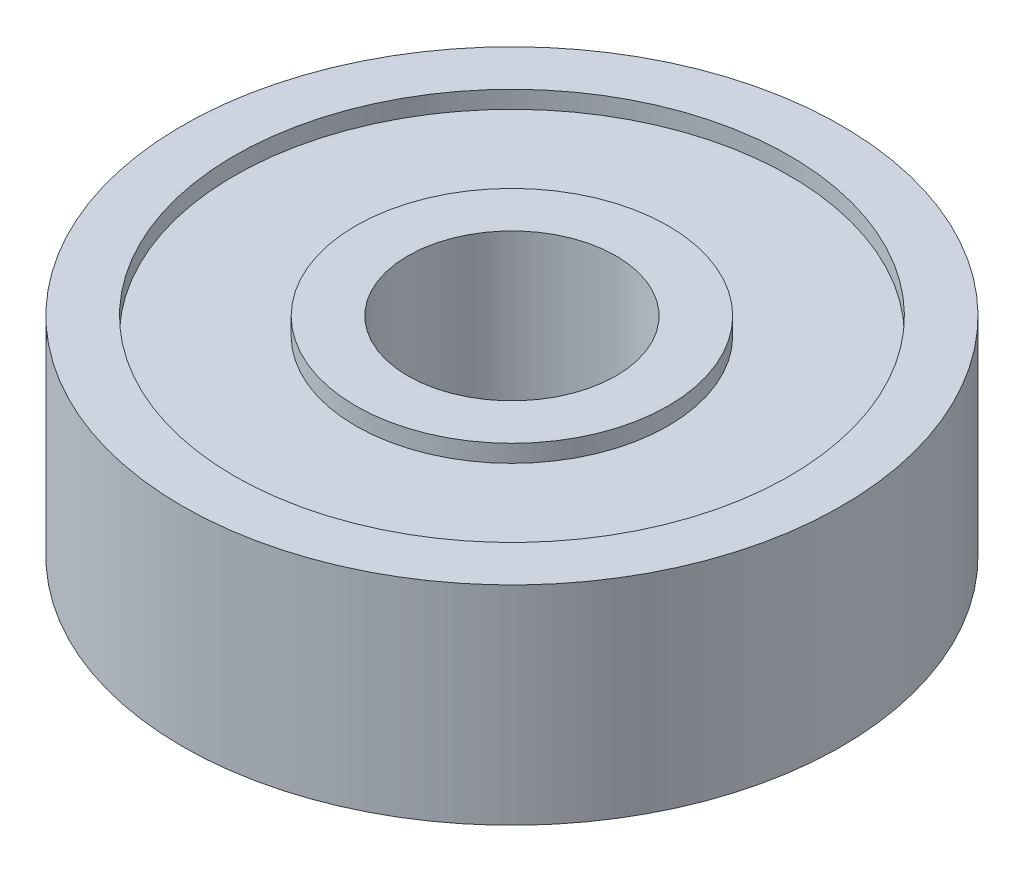
ISO-10303-21;
HEADER;
FILE_DESCRIPTION(('STEP AP214'),'2;1');
FILE_NAME('part.step','',(''),(''),'','','');
FILE_SCHEMA(('AUTOMOTIVE_DESIGN { 1 0 10303 214 1 1 1 1 }'));
ENDSEC;
DATA;
#1=APPLICATION_CONTEXT('core data for automotive mechanical design processes');
#2=APPLICATION_PROTOCOL_DEFINITION('international standard','automotive_design',2000,#1);
#3=PRODUCT_CONTEXT('',#1,'mechanical');
#4=PRODUCT('Part','Part','',(#3));
#5=PRODUCT_RELATED_PRODUCT_CATEGORY('part','',(#4));
#6=PRODUCT_DEFINITION_FORMATION('','',#4);
#7=PRODUCT_DEFINITION_CONTEXT('part definition',#1,'design');
#8=PRODUCT_DEFINITION('design','',#6,#7);
#9=PRODUCT_DEFINITION_SHAPE('','',#8);
#10=(LENGTH_UNIT() NAMED_UNIT(*) SI_UNIT(.MILLI.,.METRE.));
#11=(NAMED_UNIT(*) PLANE_ANGLE_UNIT() SI_UNIT($,.RADIAN.));
#12=(NAMED_UNIT(*) SI_UNIT($,.STERADIAN.) SOLID_ANGLE_UNIT());
#13=UNCERTAINTY_MEASURE_WITH_UNIT(LENGTH_MEASURE(1.E-05),#10,'distance_accuracy_value','');
#14=(GEOMETRIC_REPRESENTATION_CONTEXT(3) GLOBAL_UNCERTAINTY_ASSIGNED_CONTEXT((#13)) GLOBAL_UNIT_ASSIGNED_CONTEXT((#10,
#11,#12)) REPRESENTATION_CONTEXT('',''));
#15=CARTESIAN_POINT('',(0.,0.,0.));
#16=DIRECTION('',(0.,0.,1.));
#17=DIRECTION('',(1.,0.,0.));
#18=AXIS2_PLACEMENT_3D('',#15,#16,#17);
#19=CARTESIAN_POINT('',(0.,13.877117287543,0.));
#20=DIRECTION('',(0.,1.,0.));
#21=DIRECTION('',(0.,0.,1.));
#22=AXIS2_PLACEMENT_3D('',#19,#20,#21);
#23=CYLINDRICAL_SURFACE('',#22,4.5);
#24=CARTESIAN_POINT('',(0.,-2.5,0.));
#25=DIRECTION('',(0.,1.,0.));
#26=DIRECTION('',(0.,0.,1.));
#27=AXIS2_PLACEMENT_3D('',#24,#25,#26);
#28=CIRCLE('',#27,4.5);
#29=CARTESIAN_POINT('',(0.,-2.5,4.5));
#30=VERTEX_POINT('',#29);
#31=EDGE_CURVE('E55',#30,#30,#28,.T.);
#32=ORIENTED_EDGE('',*,*,#31,.F.);
#33=EDGE_LOOP('',(#32));
#34=FACE_BOUND('',#33,.T.);
#35=CARTESIAN_POINT('',(0.,-3.,0.));
#36=DIRECTION('',(0.,1.,0.));
#37=DIRECTION('',(0.,0.,1.));
#38=AXIS2_PLACEMENT_3D('',#35,#36,#37);
#39=CIRCLE('',#38,4.5);
#40=CARTESIAN_POINT('',(0.,-3.,4.5));
#41=VERTEX_POINT('',#40);
#42=EDGE_CURVE('E39',#41,#41,#39,.T.);
#43=ORIENTED_EDGE('',*,*,#42,.T.);
#44=EDGE_LOOP('',(#43));
#45=FACE_BOUND('',#44,.T.);
#46=ADVANCED_FACE('F32',(#34,#45),#23,.T.);
#47=CARTESIAN_POINT('',(0.,13.877117287543,0.));
#48=DIRECTION('',(0.,1.,0.));
#49=DIRECTION('',(0.,0.,1.));
#50=AXIS2_PLACEMENT_3D('',#47,#48,#49);
#51=CYLINDRICAL_SURFACE('',#50,3.);
#52=CARTESIAN_POINT('',(0.,-3.,0.));
#53=DIRECTION('',(0.,1.,0.));
#54=DIRECTION('',(0.,0.,1.));
#55=AXIS2_PLACEMENT_3D('',#52,#53,#54);
#56=CIRCLE('',#55,3.);
#57=CARTESIAN_POINT('',(0.,-3.,3.));
#58=VERTEX_POINT('',#57);
#59=EDGE_CURVE('E10',#58,#58,#56,.T.);
#60=ORIENTED_EDGE('',*,*,#59,.F.);
#61=EDGE_LOOP('',(#60));
#62=FACE_BOUND('',#61,.T.);
#63=CARTESIAN_POINT('',(0.,3.,0.));
#64=DIRECTION('',(0.,1.,0.));
#65=DIRECTION('',(0.,0.,1.));
#66=AXIS2_PLACEMENT_3D('',#63,#64,#65);
#67=CIRCLE('',#66,3.);
#68=CARTESIAN_POINT('',(0.,3.,3.));
#69=VERTEX_POINT('',#68);
#70=EDGE_CURVE('E47',#69,#69,#67,.T.);
#71=ORIENTED_EDGE('',*,*,#70,.T.);
#72=EDGE_LOOP('',(#71));
#73=FACE_BOUND('',#72,.T.);
#74=ADVANCED_FACE('F34',(#62,#73),#51,.F.);
#75=CARTESIAN_POINT('',(3.,-3.,0.));
#76=DIRECTION('',(0.,1.,0.));
#77=DIRECTION('',(0.,0.,1.));
#78=AXIS2_PLACEMENT_3D('',#75,#76,#77);
#79=PLANE('',#78);
#80=ORIENTED_EDGE('',*,*,#42,.F.);
#81=EDGE_LOOP('',(#80));
#82=FACE_BOUND('',#81,.T.);
#83=ORIENTED_EDGE('',*,*,#59,.T.);
#84=EDGE_LOOP('',(#83));
#85=FACE_BOUND('',#84,.T.);
#86=ADVANCED_FACE('F117',(#82,#85),#79,.F.);
#87=CARTESIAN_POINT('',(0.,2.5,0.));
#88=DIRECTION('',(0.,1.,0.));
#89=DIRECTION('',(0.,0.,1.));
#90=AXIS2_PLACEMENT_3D('',#87,#88,#89);
#91=CIRCLE('',#90,4.5);
#92=CARTESIAN_POINT('',(0.,2.5,4.5));
#93=VERTEX_POINT('',#92);
#94=EDGE_CURVE('E58',#93,#93,#91,.T.);
#95=ORIENTED_EDGE('',*,*,#94,.T.);
#96=EDGE_LOOP('',(#95));
#97=FACE_BOUND('',#96,.T.);
#98=CARTESIAN_POINT('',(0.,3.,0.));
#99=DIRECTION('',(0.,1.,0.));
#100=DIRECTION('',(0.,0.,1.));
#101=AXIS2_PLACEMENT_3D('',#98,#99,#100);
#102=CIRCLE('',#101,4.5);
#103=CARTESIAN_POINT('',(0.,3.,4.5));
#104=VERTEX_POINT('',#103);
#105=EDGE_CURVE('E43',#104,#104,#102,.T.);
#106=ORIENTED_EDGE('',*,*,#105,.F.);
#107=EDGE_LOOP('',(#106));
#108=FACE_BOUND('',#107,.T.);
#109=ADVANCED_FACE('F113',(#97,#108),#23,.T.);
#110=CARTESIAN_POINT('',(3.,3.,0.));
#111=DIRECTION('',(0.,-1.,0.));
#112=DIRECTION('',(0.,0.,-1.));
#113=AXIS2_PLACEMENT_3D('',#110,#111,#112);
#114=PLANE('',#113);
#115=ORIENTED_EDGE('',*,*,#70,.F.);
#116=EDGE_LOOP('',(#115));
#117=FACE_BOUND('',#116,.T.);
#118=ORIENTED_EDGE('',*,*,#105,.T.);
#119=EDGE_LOOP('',(#118));
#120=FACE_BOUND('',#119,.T.);
#121=ADVANCED_FACE('F122',(#117,#120),#114,.F.);
#122=CARTESIAN_POINT('',(-8.,-2.5,0.));
#123=DIRECTION('',(0.,-1.,0.));
#124=DIRECTION('',(0.,0.,-1.));
#125=AXIS2_PLACEMENT_3D('',#122,#123,#124);
#126=PLANE('',#125);
#127=ORIENTED_EDGE('',*,*,#31,.T.);
#128=EDGE_LOOP('',(#127));
#129=FACE_BOUND('',#128,.T.);
#130=CARTESIAN_POINT('',(0.,-2.5,0.));
#131=DIRECTION('',(0.,1.,0.));
#132=DIRECTION('',(0.,0.,1.));
#133=AXIS2_PLACEMENT_3D('',#130,#131,#132);
#134=CIRCLE('',#133,8.);
#135=CARTESIAN_POINT('',(0.,-2.5,8.));
#136=VERTEX_POINT('',#135);
#137=EDGE_CURVE('E52',#136,#136,#134,.T.);
#138=ORIENTED_EDGE('',*,*,#137,.F.);
#139=EDGE_LOOP('',(#138));
#140=FACE_BOUND('',#139,.T.);
#141=ADVANCED_FACE('F107',(#129,#140),#126,.T.);
#142=CARTESIAN_POINT('',(-8.,2.5,0.));
#143=DIRECTION('',(0.,1.,0.));
#144=DIRECTION('',(0.,0.,1.));
#145=AXIS2_PLACEMENT_3D('',#142,#143,#144);
#146=PLANE('',#145);
#147=CARTESIAN_POINT('',(0.,2.5,0.));
#148=DIRECTION('',(0.,1.,0.));
#149=DIRECTION('',(0.,0.,1.));
#150=AXIS2_PLACEMENT_3D('',#147,#148,#149);
#151=CIRCLE('',#150,8.);
#152=CARTESIAN_POINT('',(0.,2.5,8.));
#153=VERTEX_POINT('',#152);
#154=EDGE_CURVE('E61',#153,#153,#151,.T.);
#155=ORIENTED_EDGE('',*,*,#154,.T.);
#156=EDGE_LOOP('',(#155));
#157=FACE_BOUND('',#156,.T.);
#158=ORIENTED_EDGE('',*,*,#94,.F.);
#159=EDGE_LOOP('',(#158));
#160=FACE_BOUND('',#159,.T.);
#161=ADVANCED_FACE('F99',(#157,#160),#146,.T.);
#162=CARTESIAN_POINT('',(0.,13.877117287543,0.));
#163=DIRECTION('',(0.,1.,0.));
#164=DIRECTION('',(0.,0.,1.));
#165=AXIS2_PLACEMENT_3D('',#162,#163,#164);
#166=CYLINDRICAL_SURFACE('',#165,8.);
#167=ORIENTED_EDGE('',*,*,#137,.T.);
#168=EDGE_LOOP('',(#167));
#169=FACE_BOUND('',#168,.T.);
#170=CARTESIAN_POINT('',(0.,-3.,0.));
#171=DIRECTION('',(0.,1.,0.));
#172=DIRECTION('',(0.,0.,1.));
#173=AXIS2_PLACEMENT_3D('',#170,#171,#172);
#174=CIRCLE('',#173,8.);
#175=CARTESIAN_POINT('',(0.,-3.,8.));
#176=VERTEX_POINT('',#175);
#177=EDGE_CURVE('E64',#176,#176,#174,.T.);
#178=ORIENTED_EDGE('',*,*,#177,.F.);
#179=EDGE_LOOP('',(#178));
#180=FACE_BOUND('',#179,.T.);
#181=ADVANCED_FACE('F97',(#169,#180),#166,.F.);
#182=ORIENTED_EDGE('',*,*,#154,.F.);
#183=EDGE_LOOP('',(#182));
#184=FACE_BOUND('',#183,.T.);
#185=CARTESIAN_POINT('',(0.,3.,0.));
#186=DIRECTION('',(0.,1.,0.));
#187=DIRECTION('',(0.,0.,1.));
#188=AXIS2_PLACEMENT_3D('',#185,#186,#187);
#189=CIRCLE('',#188,8.);
#190=CARTESIAN_POINT('',(0.,3.,8.));
#191=VERTEX_POINT('',#190);
#192=EDGE_CURVE('E73',#191,#191,#189,.T.);
#193=ORIENTED_EDGE('',*,*,#192,.T.);
#194=EDGE_LOOP('',(#193));
#195=FACE_BOUND('',#194,.T.);
#196=ADVANCED_FACE('F77',(#184,#195),#166,.F.);
#197=CARTESIAN_POINT('',(8.,-3.,0.));
#198=DIRECTION('',(0.,1.,0.));
#199=DIRECTION('',(0.,0.,1.));
#200=AXIS2_PLACEMENT_3D('',#197,#198,#199);
#201=PLANE('',#200);
#202=CARTESIAN_POINT('',(0.,-3.,0.));
#203=DIRECTION('',(0.,1.,0.));
#204=DIRECTION('',(0.,0.,1.));
#205=AXIS2_PLACEMENT_3D('',#202,#203,#204);
#206=CIRCLE('',#205,9.5);
#207=CARTESIAN_POINT('',(0.,-3.,9.5));
#208=VERTEX_POINT('',#207);
#209=EDGE_CURVE('E67',#208,#208,#206,.T.);
#210=ORIENTED_EDGE('',*,*,#209,.F.);
#211=EDGE_LOOP('',(#210));
#212=FACE_BOUND('',#211,.T.);
#213=ORIENTED_EDGE('',*,*,#177,.T.);
#214=EDGE_LOOP('',(#213));
#215=FACE_BOUND('',#214,.T.);
#216=ADVANCED_FACE('F88',(#212,#215),#201,.F.);
#217=CARTESIAN_POINT('',(0.,13.877117287543,0.));
#218=DIRECTION('',(0.,1.,0.));
#219=DIRECTION('',(0.,0.,1.));
#220=AXIS2_PLACEMENT_3D('',#217,#218,#219);
#221=CYLINDRICAL_SURFACE('',#220,9.5);
#222=CARTESIAN_POINT('',(0.,3.,0.));
#223=DIRECTION('',(0.,1.,0.));
#224=DIRECTION('',(0.,0.,1.));
#225=AXIS2_PLACEMENT_3D('',#222,#223,#224);
#226=CIRCLE('',#225,9.5);
#227=CARTESIAN_POINT('',(0.,3.,9.5));
#228=VERTEX_POINT('',#227);
#229=EDGE_CURVE('E70',#228,#228,#226,.T.);
#230=ORIENTED_EDGE('',*,*,#229,.F.);
#231=EDGE_LOOP('',(#230));
#232=FACE_BOUND('',#231,.T.);
#233=ORIENTED_EDGE('',*,*,#209,.T.);
#234=EDGE_LOOP('',(#233));
#235=FACE_BOUND('',#234,.T.);
#236=ADVANCED_FACE('F82',(#232,#235),#221,.T.);
#237=CARTESIAN_POINT('',(8.,3.,0.));
#238=DIRECTION('',(0.,-1.,0.));
#239=DIRECTION('',(0.,0.,-1.));
#240=AXIS2_PLACEMENT_3D('',#237,#238,#239);
#241=PLANE('',#240);
#242=ORIENTED_EDGE('',*,*,#192,.F.);
#243=EDGE_LOOP('',(#242));
#244=FACE_BOUND('',#243,.T.);
#245=ORIENTED_EDGE('',*,*,#229,.T.);
#246=EDGE_LOOP('',(#245));
#247=FACE_BOUND('',#246,.T.);
#248=ADVANCED_FACE('F79',(#244,#247),#241,.F.);
#249=CLOSED_SHELL('',(#46,#74,#86,#109,#121,#141,#161,#181,#196,#216,#236,#248));
#250=MANIFOLD_SOLID_BREP('B2',#249);
#251=ADVANCED_BREP_SHAPE_REPRESENTATION('',(#18,#250),#14);
#252=SHAPE_DEFINITION_REPRESENTATION(#9,#251);
ENDSEC;
END-ISO-10303-21;
